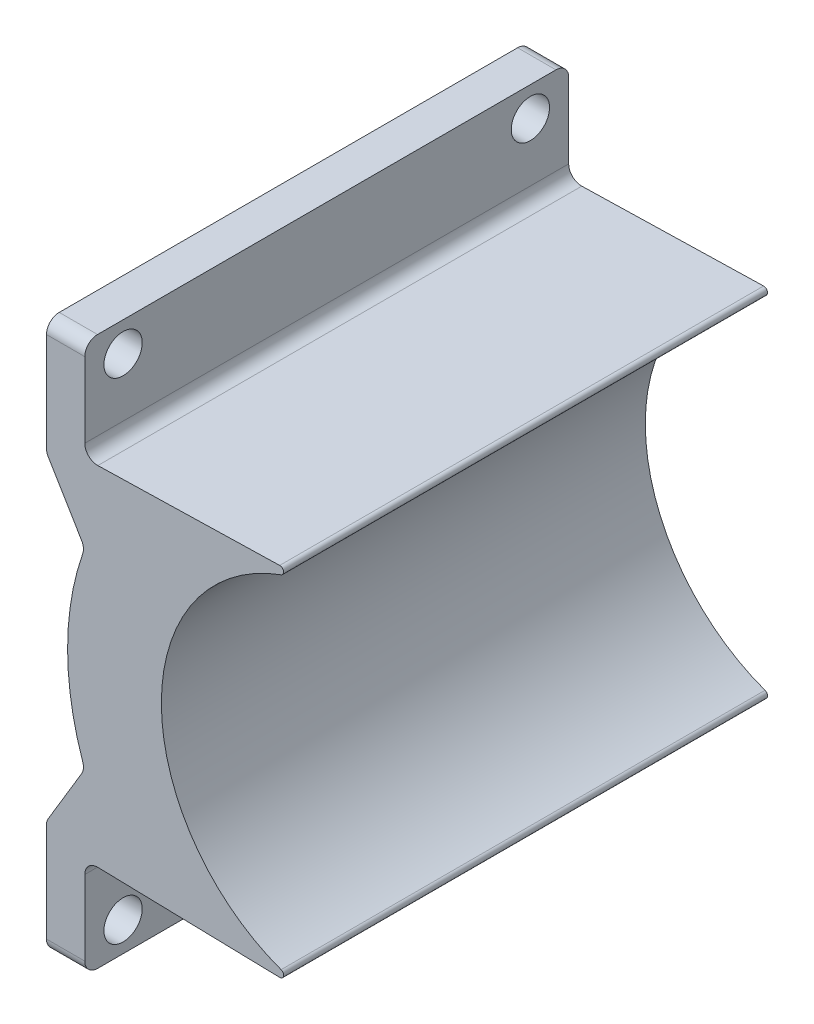
ISO-10303-21;
HEADER;
FILE_DESCRIPTION(('STEP AP214'),'2;1');
FILE_NAME('part.step','',(''),(''),'','','');
FILE_SCHEMA(('AUTOMOTIVE_DESIGN { 1 0 10303 214 1 1 1 1 }'));
ENDSEC;
DATA;
#1=APPLICATION_CONTEXT('core data for automotive mechanical design processes');
#2=APPLICATION_PROTOCOL_DEFINITION('international standard','automotive_design',2000,#1);
#3=PRODUCT_CONTEXT('',#1,'mechanical');
#4=PRODUCT('Part','Part','',(#3));
#5=PRODUCT_RELATED_PRODUCT_CATEGORY('part','',(#4));
#6=PRODUCT_DEFINITION_FORMATION('','',#4);
#7=PRODUCT_DEFINITION_CONTEXT('part definition',#1,'design');
#8=PRODUCT_DEFINITION('design','',#6,#7);
#9=PRODUCT_DEFINITION_SHAPE('','',#8);
#10=(LENGTH_UNIT() NAMED_UNIT(*) SI_UNIT(.MILLI.,.METRE.));
#11=(NAMED_UNIT(*) PLANE_ANGLE_UNIT() SI_UNIT($,.RADIAN.));
#12=(NAMED_UNIT(*) SI_UNIT($,.STERADIAN.) SOLID_ANGLE_UNIT());
#13=UNCERTAINTY_MEASURE_WITH_UNIT(LENGTH_MEASURE(1.E-05),#10,'distance_accuracy_value','');
#14=(GEOMETRIC_REPRESENTATION_CONTEXT(3) GLOBAL_UNCERTAINTY_ASSIGNED_CONTEXT((#13)) GLOBAL_UNIT_ASSIGNED_CONTEXT((#10,
#11,#12)) REPRESENTATION_CONTEXT('',''));
#15=CARTESIAN_POINT('',(0.,0.,0.));
#16=DIRECTION('',(0.,0.,1.));
#17=DIRECTION('',(1.,0.,0.));
#18=AXIS2_PLACEMENT_3D('',#15,#16,#17);
#19=CARTESIAN_POINT('',(18.75,-21.5,37.9));
#20=DIRECTION('',(0.,0.,-1.));
#21=DIRECTION('',(-1.,0.,0.));
#22=AXIS2_PLACEMENT_3D('',#19,#20,#21);
#23=CYLINDRICAL_SURFACE('',#22,14.25);
#24=CARTESIAN_POINT('',(18.75,-21.5,37.9));
#25=DIRECTION('',(0.,0.,-1.));
#26=DIRECTION('',(1.,0.,0.));
#27=AXIS2_PLACEMENT_3D('',#24,#25,#26);
#28=CIRCLE('',#27,14.25);
#29=CARTESIAN_POINT('',(13.8758581465077,-34.890490700196,37.9));
#30=VERTEX_POINT('',#29);
#31=CARTESIAN_POINT('',(13.8758581465076,-8.10950929980405,37.9));
#32=VERTEX_POINT('',#31);
#33=EDGE_CURVE('E222',#30,#32,#28,.T.);
#34=ORIENTED_EDGE('',*,*,#33,.F.);
#35=DIRECTION('',(0.,0.,-1.));
#36=VECTOR('',#35,1.);
#37=CARTESIAN_POINT('',(13.8758581465077,-34.8904907001959,37.9));
#38=LINE('',#37,#36);
#39=CARTESIAN_POINT('',(13.8758581465077,-34.890490700196,0.));
#40=VERTEX_POINT('',#39);
#41=EDGE_CURVE('E208',#30,#40,#38,.T.);
#42=ORIENTED_EDGE('',*,*,#41,.T.);
#43=CARTESIAN_POINT('',(18.75,-21.5,0.));
#44=DIRECTION('',(0.,0.,-1.));
#45=DIRECTION('',(1.,0.,0.));
#46=AXIS2_PLACEMENT_3D('',#43,#44,#45);
#47=CIRCLE('',#46,14.25);
#48=CARTESIAN_POINT('',(13.8758581465076,-8.10950929980405,0.));
#49=VERTEX_POINT('',#48);
#50=EDGE_CURVE('E219',#40,#49,#47,.T.);
#51=ORIENTED_EDGE('',*,*,#50,.T.);
#52=DIRECTION('',(0.,0.,-1.));
#53=VECTOR('',#52,1.);
#54=CARTESIAN_POINT('',(13.8758581465076,-8.10950929980405,37.9));
#55=LINE('',#54,#53);
#56=EDGE_CURVE('E223',#49,#32,#55,.F.);
#57=ORIENTED_EDGE('',*,*,#56,.T.);
#58=EDGE_LOOP('',(#34,#42,#51,#57));
#59=FACE_BOUND('',#58,.T.);
#60=ADVANCED_FACE('F41',(#59),#23,.F.);
#61=CARTESIAN_POINT('',(-1.5,-7.9,37.9));
#62=DIRECTION('',(0.0243808212590845,-0.999702743596682,0.));
#63=DIRECTION('',(0.999702743596682,0.0243808212590845,0.));
#64=AXIS2_PLACEMENT_3D('',#61,#62,#63);
#65=PLANE('',#64);
#66=DIRECTION('',(-0.999702743596682,-0.0243808212590845,0.));
#67=VECTOR('',#66,1.);
#68=CARTESIAN_POINT('',(-1.5,-7.9,0.));
#69=LINE('',#68,#67);
#70=CARTESIAN_POINT('',(13.7659303874248,-7.5276934093525,0.));
#71=VERTEX_POINT('',#70);
#72=CARTESIAN_POINT('',(-0.475619178740915,-7.87501732803644,0.));
#73=VERTEX_POINT('',#72);
#74=EDGE_CURVE('E228',#71,#73,#69,.T.);
#75=ORIENTED_EDGE('',*,*,#74,.T.);
#76=DIRECTION('',(0.,0.,-1.));
#77=VECTOR('',#76,1.);
#78=CARTESIAN_POINT('',(-0.475619178740915,-7.87501732803644,37.9));
#79=LINE('',#78,#77);
#80=CARTESIAN_POINT('',(-0.475619178740915,-7.87501732803644,37.9));
#81=VERTEX_POINT('',#80);
#82=EDGE_CURVE('E291',#73,#81,#79,.F.);
#83=ORIENTED_EDGE('',*,*,#82,.T.);
#84=DIRECTION('',(-0.999702743596682,-0.0243808212590845,0.));
#85=VECTOR('',#84,1.);
#86=CARTESIAN_POINT('',(-1.5,-7.9,37.9));
#87=LINE('',#86,#85);
#88=CARTESIAN_POINT('',(13.7659303874248,-7.5276934093525,37.9));
#89=VERTEX_POINT('',#88);
#90=EDGE_CURVE('E449',#89,#81,#87,.T.);
#91=ORIENTED_EDGE('',*,*,#90,.F.);
#92=DIRECTION('',(0.,0.,-1.));
#93=VECTOR('',#92,1.);
#94=CARTESIAN_POINT('',(13.7659303874248,-7.5276934093525,37.9));
#95=LINE('',#94,#93);
#96=EDGE_CURVE('E281',#89,#71,#95,.T.);
#97=ORIENTED_EDGE('',*,*,#96,.T.);
#98=EDGE_LOOP('',(#75,#83,#91,#97));
#99=FACE_BOUND('',#98,.T.);
#100=ADVANCED_FACE('F427',(#99),#65,.F.);
#101=CARTESIAN_POINT('',(-1.5,0.,37.9));
#102=DIRECTION('',(-1.,0.,0.));
#103=DIRECTION('',(0.,-1.,0.));
#104=AXIS2_PLACEMENT_3D('',#101,#102,#103);
#105=PLANE('',#104);
#106=CARTESIAN_POINT('',(-1.5,-2.3,3.));
#107=DIRECTION('',(-1.,0.,0.));
#108=DIRECTION('',(0.,-1.,0.));
#109=AXIS2_PLACEMENT_3D('',#106,#107,#108);
#110=CIRCLE('',#109,1.5);
#111=CARTESIAN_POINT('',(-1.5,-3.8,3.));
#112=VERTEX_POINT('',#111);
#113=EDGE_CURVE('E547',#112,#112,#110,.F.);
#114=ORIENTED_EDGE('',*,*,#113,.F.);
#115=EDGE_LOOP('',(#114));
#116=FACE_BOUND('',#115,.T.);
#117=CARTESIAN_POINT('',(-1.5,-2.3,34.9));
#118=DIRECTION('',(-1.,0.,0.));
#119=DIRECTION('',(0.,-1.,0.));
#120=AXIS2_PLACEMENT_3D('',#117,#118,#119);
#121=CIRCLE('',#120,1.5);
#122=CARTESIAN_POINT('',(-1.5,-3.8,34.9));
#123=VERTEX_POINT('',#122);
#124=EDGE_CURVE('E550',#123,#123,#121,.F.);
#125=ORIENTED_EDGE('',*,*,#124,.F.);
#126=EDGE_LOOP('',(#125));
#127=FACE_BOUND('',#126,.T.);
#128=DIRECTION('',(0.,1.,0.));
#129=VECTOR('',#128,1.);
#130=CARTESIAN_POINT('',(-1.5,0.,37.9));
#131=LINE('',#130,#129);
#132=CARTESIAN_POINT('',(-1.5,-6.87531458443975,37.9));
#133=VERTEX_POINT('',#132);
#134=CARTESIAN_POINT('',(-1.5,-0.999999999999996,37.9));
#135=VERTEX_POINT('',#134);
#136=EDGE_CURVE('E452',#133,#135,#131,.T.);
#137=ORIENTED_EDGE('',*,*,#136,.F.);
#138=DIRECTION('',(0.,0.,-1.));
#139=VECTOR('',#138,1.);
#140=CARTESIAN_POINT('',(-1.5,-6.87531458443975,0.));
#141=LINE('',#140,#139);
#142=CARTESIAN_POINT('',(-1.5,-6.87531458443975,0.));
#143=VERTEX_POINT('',#142);
#144=EDGE_CURVE('E288',#133,#143,#141,.T.);
#145=ORIENTED_EDGE('',*,*,#144,.T.);
#146=DIRECTION('',(0.,1.,0.));
#147=VECTOR('',#146,1.);
#148=CARTESIAN_POINT('',(-1.5,0.,0.));
#149=LINE('',#148,#147);
#150=CARTESIAN_POINT('',(-1.5,-0.999999999999999,0.));
#151=VERTEX_POINT('',#150);
#152=EDGE_CURVE('E232',#143,#151,#149,.T.);
#153=ORIENTED_EDGE('',*,*,#152,.T.);
#154=CARTESIAN_POINT('',(-1.5,-0.999999999999999,1.));
#155=DIRECTION('',(-1.,0.,0.));
#156=DIRECTION('',(0.,-1.,0.));
#157=AXIS2_PLACEMENT_3D('',#154,#155,#156);
#158=CIRCLE('',#157,1.);
#159=CARTESIAN_POINT('',(-1.5,0.,1.));
#160=VERTEX_POINT('',#159);
#161=EDGE_CURVE('E286',#151,#160,#158,.F.);
#162=ORIENTED_EDGE('',*,*,#161,.T.);
#163=DIRECTION('',(0.,0.,-1.));
#164=VECTOR('',#163,1.);
#165=CARTESIAN_POINT('',(-1.5,0.,37.9));
#166=LINE('',#165,#164);
#167=CARTESIAN_POINT('',(-1.5,0.,36.9));
#168=VERTEX_POINT('',#167);
#169=EDGE_CURVE('E271',#168,#160,#166,.T.);
#170=ORIENTED_EDGE('',*,*,#169,.F.);
#171=CARTESIAN_POINT('',(-1.5,-0.999999999999996,36.9));
#172=DIRECTION('',(-1.,0.,0.));
#173=DIRECTION('',(0.,-1.,0.));
#174=AXIS2_PLACEMENT_3D('',#171,#172,#173);
#175=CIRCLE('',#174,1.);
#176=EDGE_CURVE('E284',#168,#135,#175,.F.);
#177=ORIENTED_EDGE('',*,*,#176,.T.);
#178=EDGE_LOOP('',(#137,#145,#153,#162,#170,#177));
#179=FACE_BOUND('',#178,.T.);
#180=ADVANCED_FACE('F434',(#116,#127,#179),#105,.F.);
#181=CARTESIAN_POINT('',(-1.5,0.,37.9));
#182=DIRECTION('',(0.,-1.,0.));
#183=DIRECTION('',(1.,0.,0.));
#184=AXIS2_PLACEMENT_3D('',#181,#182,#183);
#185=PLANE('',#184);
#186=ORIENTED_EDGE('',*,*,#169,.T.);
#187=DIRECTION('',(-1.,0.,0.));
#188=VECTOR('',#187,1.);
#189=CARTESIAN_POINT('',(-1.5,0.,1.));
#190=LINE('',#189,#188);
#191=CARTESIAN_POINT('',(-4.5,0.,1.));
#192=VERTEX_POINT('',#191);
#193=EDGE_CURVE('E353',#160,#192,#190,.T.);
#194=ORIENTED_EDGE('',*,*,#193,.T.);
#195=DIRECTION('',(0.,0.,-1.));
#196=VECTOR('',#195,1.);
#197=CARTESIAN_POINT('',(-4.5,0.,37.9));
#198=LINE('',#197,#196);
#199=CARTESIAN_POINT('',(-4.5,0.,36.9));
#200=VERTEX_POINT('',#199);
#201=EDGE_CURVE('E269',#200,#192,#198,.T.);
#202=ORIENTED_EDGE('',*,*,#201,.F.);
#203=DIRECTION('',(-1.,0.,0.));
#204=VECTOR('',#203,1.);
#205=CARTESIAN_POINT('',(-1.5,0.,36.9));
#206=LINE('',#205,#204);
#207=EDGE_CURVE('E351',#200,#168,#206,.F.);
#208=ORIENTED_EDGE('',*,*,#207,.T.);
#209=EDGE_LOOP('',(#186,#194,#202,#208));
#210=FACE_BOUND('',#209,.T.);
#211=ADVANCED_FACE('F467',(#210),#185,.F.);
#212=CARTESIAN_POINT('',(-4.5,0.,37.9));
#213=DIRECTION('',(1.,0.,0.));
#214=DIRECTION('',(0.,1.,0.));
#215=AXIS2_PLACEMENT_3D('',#212,#213,#214);
#216=PLANE('',#215);
#217=CARTESIAN_POINT('',(-4.5,-2.3,3.));
#218=DIRECTION('',(-1.,0.,0.));
#219=DIRECTION('',(0.,1.,0.));
#220=AXIS2_PLACEMENT_3D('',#217,#218,#219);
#221=CIRCLE('',#220,1.5);
#222=CARTESIAN_POINT('',(-4.5,-0.799999999999995,3.));
#223=VERTEX_POINT('',#222);
#224=EDGE_CURVE('E561',#223,#223,#221,.T.);
#225=ORIENTED_EDGE('',*,*,#224,.F.);
#226=EDGE_LOOP('',(#225));
#227=FACE_BOUND('',#226,.T.);
#228=CARTESIAN_POINT('',(-4.5,-2.3,34.9));
#229=DIRECTION('',(-1.,0.,0.));
#230=DIRECTION('',(0.,-1.,0.));
#231=AXIS2_PLACEMENT_3D('',#228,#229,#230);
#232=CIRCLE('',#231,1.5);
#233=CARTESIAN_POINT('',(-4.5,-3.8,34.9));
#234=VERTEX_POINT('',#233);
#235=EDGE_CURVE('E552',#234,#234,#232,.T.);
#236=ORIENTED_EDGE('',*,*,#235,.F.);
#237=EDGE_LOOP('',(#236));
#238=FACE_BOUND('',#237,.T.);
#239=DIRECTION('',(0.,-1.,0.));
#240=VECTOR('',#239,1.);
#241=CARTESIAN_POINT('',(-4.5,0.,0.));
#242=LINE('',#241,#240);
#243=CARTESIAN_POINT('',(-4.5,-1.,0.));
#244=VERTEX_POINT('',#243);
#245=CARTESIAN_POINT('',(-4.5,-8.72301603505157,0.));
#246=VERTEX_POINT('',#245);
#247=EDGE_CURVE('E243',#244,#246,#242,.T.);
#248=ORIENTED_EDGE('',*,*,#247,.T.);
#249=DIRECTION('',(0.,0.,-1.));
#250=VECTOR('',#249,1.);
#251=CARTESIAN_POINT('',(-4.5,-8.72301603505157,37.9));
#252=LINE('',#251,#250);
#253=CARTESIAN_POINT('',(-4.5,-8.72301603505157,37.9));
#254=VERTEX_POINT('',#253);
#255=EDGE_CURVE('E349',#246,#254,#252,.F.);
#256=ORIENTED_EDGE('',*,*,#255,.T.);
#257=DIRECTION('',(0.,-1.,0.));
#258=VECTOR('',#257,1.);
#259=CARTESIAN_POINT('',(-4.5,0.,37.9));
#260=LINE('',#259,#258);
#261=CARTESIAN_POINT('',(-4.5,-0.999999999999997,37.9));
#262=VERTEX_POINT('',#261);
#263=EDGE_CURVE('E394',#262,#254,#260,.T.);
#264=ORIENTED_EDGE('',*,*,#263,.F.);
#265=CARTESIAN_POINT('',(-4.5,-0.999999999999997,36.9));
#266=DIRECTION('',(1.,0.,0.));
#267=DIRECTION('',(0.,1.,0.));
#268=AXIS2_PLACEMENT_3D('',#265,#266,#267);
#269=CIRCLE('',#268,1.);
#270=EDGE_CURVE('E64',#262,#200,#269,.F.);
#271=ORIENTED_EDGE('',*,*,#270,.T.);
#272=ORIENTED_EDGE('',*,*,#201,.T.);
#273=CARTESIAN_POINT('',(-4.5,-1.,1.));
#274=DIRECTION('',(1.,0.,0.));
#275=DIRECTION('',(0.,1.,0.));
#276=AXIS2_PLACEMENT_3D('',#273,#274,#275);
#277=CIRCLE('',#276,1.);
#278=EDGE_CURVE('E56',#192,#244,#277,.F.);
#279=ORIENTED_EDGE('',*,*,#278,.T.);
#280=EDGE_LOOP('',(#248,#256,#264,#271,#272,#279));
#281=FACE_BOUND('',#280,.T.);
#282=ADVANCED_FACE('F464',(#227,#238,#281),#216,.F.);
#283=CARTESIAN_POINT('',(-4.5,-9.,37.9));
#284=DIRECTION('',(0.857492925712544,0.514495755427527,0.));
#285=DIRECTION('',(-0.514495755427527,0.857492925712544,0.));
#286=AXIS2_PLACEMENT_3D('',#283,#284,#285);
#287=PLANE('',#286);
#288=DIRECTION('',(0.514495755427527,-0.857492925712544,0.));
#289=VECTOR('',#288,1.);
#290=CARTESIAN_POINT('',(-4.5,-9.,0.));
#291=LINE('',#290,#289);
#292=CARTESIAN_POINT('',(-4.35749292571254,-9.23751179047909,0.));
#293=VERTEX_POINT('',#292);
#294=CARTESIAN_POINT('',(-1.74356341017487,-13.5940609830419,0.));
#295=VERTEX_POINT('',#294);
#296=EDGE_CURVE('E246',#293,#295,#291,.T.);
#297=ORIENTED_EDGE('',*,*,#296,.T.);
#298=DIRECTION('',(0.,0.,1.));
#299=VECTOR('',#298,1.);
#300=CARTESIAN_POINT('',(-1.74356341017487,-13.5940609830419,37.9));
#301=LINE('',#300,#299);
#302=CARTESIAN_POINT('',(-1.74356341017487,-13.5940609830419,37.9));
#303=VERTEX_POINT('',#302);
#304=EDGE_CURVE('E345',#295,#303,#301,.T.);
#305=ORIENTED_EDGE('',*,*,#304,.T.);
#306=DIRECTION('',(0.514495755427527,-0.857492925712544,0.));
#307=VECTOR('',#306,1.);
#308=CARTESIAN_POINT('',(-4.5,-9.,37.9));
#309=LINE('',#308,#307);
#310=CARTESIAN_POINT('',(-4.35749292571254,-9.23751179047909,37.9));
#311=VERTEX_POINT('',#310);
#312=EDGE_CURVE('E385',#311,#303,#309,.T.);
#313=ORIENTED_EDGE('',*,*,#312,.F.);
#314=DIRECTION('',(0.,0.,-1.));
#315=VECTOR('',#314,1.);
#316=CARTESIAN_POINT('',(-4.35749292571254,-9.23751179047909,37.9));
#317=LINE('',#316,#315);
#318=EDGE_CURVE('E342',#311,#293,#317,.T.);
#319=ORIENTED_EDGE('',*,*,#318,.T.);
#320=EDGE_LOOP('',(#297,#305,#313,#319));
#321=FACE_BOUND('',#320,.T.);
#322=ADVANCED_FACE('F372',(#321),#287,.F.);
#323=CARTESIAN_POINT('',(18.75,-21.5,37.9));
#324=DIRECTION('',(0.,0.,-1.));
#325=DIRECTION('',(-1.,0.,0.));
#326=AXIS2_PLACEMENT_3D('',#323,#324,#325);
#327=CYLINDRICAL_SURFACE('',#326,21.594270073332);
#328=CARTESIAN_POINT('',(18.75,-21.5,0.));
#329=DIRECTION('',(0.,0.,1.));
#330=DIRECTION('',(1.,0.,0.));
#331=AXIS2_PLACEMENT_3D('',#328,#329,#330);
#332=CIRCLE('',#331,21.594270073332);
#333=CARTESIAN_POINT('',(-1.65607974374301,-14.4356946914788,0.));
#334=VERTEX_POINT('',#333);
#335=CARTESIAN_POINT('',(-1.65607974374301,-28.5643053085212,0.));
#336=VERTEX_POINT('',#335);
#337=EDGE_CURVE('E249',#334,#336,#332,.T.);
#338=ORIENTED_EDGE('',*,*,#337,.T.);
#339=DIRECTION('',(0.,0.,-1.));
#340=VECTOR('',#339,1.);
#341=CARTESIAN_POINT('',(-1.65607974374302,-28.5643053085212,37.9));
#342=LINE('',#341,#340);
#343=CARTESIAN_POINT('',(-1.65607974374301,-28.5643053085212,37.9));
#344=VERTEX_POINT('',#343);
#345=EDGE_CURVE('E340',#336,#344,#342,.F.);
#346=ORIENTED_EDGE('',*,*,#345,.T.);
#347=CARTESIAN_POINT('',(18.75,-21.5,37.9));
#348=DIRECTION('',(0.,0.,1.));
#349=DIRECTION('',(1.,0.,0.));
#350=AXIS2_PLACEMENT_3D('',#347,#348,#349);
#351=CIRCLE('',#350,21.594270073332);
#352=CARTESIAN_POINT('',(-1.65607974374301,-14.4356946914788,37.9));
#353=VERTEX_POINT('',#352);
#354=EDGE_CURVE('E383',#353,#344,#351,.T.);
#355=ORIENTED_EDGE('',*,*,#354,.F.);
#356=DIRECTION('',(0.,0.,-1.));
#357=VECTOR('',#356,1.);
#358=CARTESIAN_POINT('',(-1.65607974374301,-14.4356946914788,37.9));
#359=LINE('',#358,#357);
#360=EDGE_CURVE('E337',#353,#334,#359,.T.);
#361=ORIENTED_EDGE('',*,*,#360,.T.);
#362=EDGE_LOOP('',(#338,#346,#355,#361));
#363=FACE_BOUND('',#362,.T.);
#364=ADVANCED_FACE('F387',(#363),#327,.T.);
#365=CARTESIAN_POINT('',(-4.5,-34.,37.9));
#366=DIRECTION('',(0.857492925712544,-0.514495755427527,0.));
#367=DIRECTION('',(0.514495755427527,0.857492925712544,0.));
#368=AXIS2_PLACEMENT_3D('',#365,#366,#367);
#369=PLANE('',#368);
#370=DIRECTION('',(-0.514495755427527,-0.857492925712544,0.));
#371=VECTOR('',#370,1.);
#372=CARTESIAN_POINT('',(-4.5,-34.,0.));
#373=LINE('',#372,#371);
#374=CARTESIAN_POINT('',(-1.74356341017486,-29.4059390169581,0.));
#375=VERTEX_POINT('',#374);
#376=CARTESIAN_POINT('',(-4.35749292571254,-33.7624882095209,0.));
#377=VERTEX_POINT('',#376);
#378=EDGE_CURVE('E252',#375,#377,#373,.T.);
#379=ORIENTED_EDGE('',*,*,#378,.T.);
#380=DIRECTION('',(0.,0.,-1.));
#381=VECTOR('',#380,1.);
#382=CARTESIAN_POINT('',(-4.35749292571254,-33.7624882095209,37.9));
#383=LINE('',#382,#381);
#384=CARTESIAN_POINT('',(-4.35749292571254,-33.7624882095209,37.9));
#385=VERTEX_POINT('',#384);
#386=EDGE_CURVE('E335',#377,#385,#383,.F.);
#387=ORIENTED_EDGE('',*,*,#386,.T.);
#388=DIRECTION('',(-0.514495755427527,-0.857492925712544,0.));
#389=VECTOR('',#388,1.);
#390=CARTESIAN_POINT('',(-4.5,-34.,37.9));
#391=LINE('',#390,#389);
#392=CARTESIAN_POINT('',(-1.74356341017486,-29.4059390169581,37.9));
#393=VERTEX_POINT('',#392);
#394=EDGE_CURVE('E389',#393,#385,#391,.T.);
#395=ORIENTED_EDGE('',*,*,#394,.F.);
#396=DIRECTION('',(0.,0.,1.));
#397=VECTOR('',#396,1.);
#398=CARTESIAN_POINT('',(-1.74356341017486,-29.4059390169581,0.));
#399=LINE('',#398,#397);
#400=EDGE_CURVE('E332',#393,#375,#399,.F.);
#401=ORIENTED_EDGE('',*,*,#400,.T.);
#402=EDGE_LOOP('',(#379,#387,#395,#401));
#403=FACE_BOUND('',#402,.T.);
#404=ADVANCED_FACE('F524',(#403),#369,.F.);
#405=CARTESIAN_POINT('',(-4.5,-43.,37.9));
#406=DIRECTION('',(1.,0.,0.));
#407=DIRECTION('',(0.,1.,0.));
#408=AXIS2_PLACEMENT_3D('',#405,#406,#407);
#409=PLANE('',#408);
#410=CARTESIAN_POINT('',(-4.5,-40.7,34.9));
#411=DIRECTION('',(-1.,0.,0.));
#412=DIRECTION('',(0.,1.,0.));
#413=AXIS2_PLACEMENT_3D('',#410,#411,#412);
#414=CIRCLE('',#413,1.5);
#415=CARTESIAN_POINT('',(-4.5,-39.2,34.9));
#416=VERTEX_POINT('',#415);
#417=EDGE_CURVE('E560',#416,#416,#414,.T.);
#418=ORIENTED_EDGE('',*,*,#417,.F.);
#419=EDGE_LOOP('',(#418));
#420=FACE_BOUND('',#419,.T.);
#421=CARTESIAN_POINT('',(-4.5,-40.7,3.));
#422=DIRECTION('',(-1.,0.,0.));
#423=DIRECTION('',(0.,-1.,0.));
#424=AXIS2_PLACEMENT_3D('',#421,#422,#423);
#425=CIRCLE('',#424,1.5);
#426=CARTESIAN_POINT('',(-4.5,-42.2,3.));
#427=VERTEX_POINT('',#426);
#428=EDGE_CURVE('E235',#427,#427,#425,.T.);
#429=ORIENTED_EDGE('',*,*,#428,.F.);
#430=EDGE_LOOP('',(#429));
#431=FACE_BOUND('',#430,.T.);
#432=DIRECTION('',(0.,-1.,0.));
#433=VECTOR('',#432,1.);
#434=CARTESIAN_POINT('',(-4.5,-43.,0.));
#435=LINE('',#434,#433);
#436=CARTESIAN_POINT('',(-4.5,-34.2769839649484,0.));
#437=VERTEX_POINT('',#436);
#438=CARTESIAN_POINT('',(-4.5,-42.,0.));
#439=VERTEX_POINT('',#438);
#440=EDGE_CURVE('E255',#437,#439,#435,.T.);
#441=ORIENTED_EDGE('',*,*,#440,.T.);
#442=CARTESIAN_POINT('',(-4.5,-42.,1.));
#443=DIRECTION('',(1.,0.,0.));
#444=DIRECTION('',(0.,1.,0.));
#445=AXIS2_PLACEMENT_3D('',#442,#443,#444);
#446=CIRCLE('',#445,1.);
#447=CARTESIAN_POINT('',(-4.5,-43.,1.));
#448=VERTEX_POINT('',#447);
#449=EDGE_CURVE('E320',#439,#448,#446,.F.);
#450=ORIENTED_EDGE('',*,*,#449,.T.);
#451=DIRECTION('',(0.,0.,-1.));
#452=VECTOR('',#451,1.);
#453=CARTESIAN_POINT('',(-4.5,-43.,37.9));
#454=LINE('',#453,#452);
#455=CARTESIAN_POINT('',(-4.5,-43.,36.9));
#456=VERTEX_POINT('',#455);
#457=EDGE_CURVE('E266',#456,#448,#454,.T.);
#458=ORIENTED_EDGE('',*,*,#457,.F.);
#459=CARTESIAN_POINT('',(-4.5,-42.,36.9));
#460=DIRECTION('',(1.,0.,0.));
#461=DIRECTION('',(0.,1.,0.));
#462=AXIS2_PLACEMENT_3D('',#459,#460,#461);
#463=CIRCLE('',#462,1.);
#464=CARTESIAN_POINT('',(-4.5,-42.,37.9));
#465=VERTEX_POINT('',#464);
#466=EDGE_CURVE('E318',#456,#465,#463,.F.);
#467=ORIENTED_EDGE('',*,*,#466,.T.);
#468=DIRECTION('',(0.,-1.,0.));
#469=VECTOR('',#468,1.);
#470=CARTESIAN_POINT('',(-4.5,-43.,37.9));
#471=LINE('',#470,#469);
#472=CARTESIAN_POINT('',(-4.5,-34.2769839649484,37.9));
#473=VERTEX_POINT('',#472);
#474=EDGE_CURVE('E392',#473,#465,#471,.T.);
#475=ORIENTED_EDGE('',*,*,#474,.F.);
#476=DIRECTION('',(0.,0.,-1.));
#477=VECTOR('',#476,1.);
#478=CARTESIAN_POINT('',(-4.5,-34.2769839649484,37.9));
#479=LINE('',#478,#477);
#480=EDGE_CURVE('E315',#473,#437,#479,.T.);
#481=ORIENTED_EDGE('',*,*,#480,.T.);
#482=EDGE_LOOP('',(#441,#450,#458,#467,#475,#481));
#483=FACE_BOUND('',#482,.T.);
#484=ADVANCED_FACE('F504',(#420,#431,#483),#409,.F.);
#485=CARTESIAN_POINT('',(-1.5,-43.,37.9));
#486=DIRECTION('',(0.,1.,0.));
#487=DIRECTION('',(0.,0.,1.));
#488=AXIS2_PLACEMENT_3D('',#485,#486,#487);
#489=PLANE('',#488);
#490=ORIENTED_EDGE('',*,*,#457,.T.);
#491=DIRECTION('',(1.,0.,0.));
#492=VECTOR('',#491,1.);
#493=CARTESIAN_POINT('',(-1.5,-43.,1.));
#494=LINE('',#493,#492);
#495=CARTESIAN_POINT('',(-1.5,-43.,1.));
#496=VERTEX_POINT('',#495);
#497=EDGE_CURVE('E304',#448,#496,#494,.T.);
#498=ORIENTED_EDGE('',*,*,#497,.T.);
#499=DIRECTION('',(0.,0.,-1.));
#500=VECTOR('',#499,1.);
#501=CARTESIAN_POINT('',(-1.5,-43.,37.9));
#502=LINE('',#501,#500);
#503=CARTESIAN_POINT('',(-1.5,-43.,36.9));
#504=VERTEX_POINT('',#503);
#505=EDGE_CURVE('E263',#504,#496,#502,.T.);
#506=ORIENTED_EDGE('',*,*,#505,.F.);
#507=DIRECTION('',(1.,0.,0.));
#508=VECTOR('',#507,1.);
#509=CARTESIAN_POINT('',(-4.5,-43.,36.9));
#510=LINE('',#509,#508);
#511=EDGE_CURVE('E302',#504,#456,#510,.F.);
#512=ORIENTED_EDGE('',*,*,#511,.T.);
#513=EDGE_LOOP('',(#490,#498,#506,#512));
#514=FACE_BOUND('',#513,.T.);
#515=ADVANCED_FACE('F514',(#514),#489,.F.);
#516=CARTESIAN_POINT('',(-1.5,-43.,37.9));
#517=DIRECTION('',(-1.,0.,0.));
#518=DIRECTION('',(0.,-1.,0.));
#519=AXIS2_PLACEMENT_3D('',#516,#517,#518);
#520=PLANE('',#519);
#521=CARTESIAN_POINT('',(-1.5,-40.7,34.9));
#522=DIRECTION('',(-1.,0.,0.));
#523=DIRECTION('',(0.,-1.,0.));
#524=AXIS2_PLACEMENT_3D('',#521,#522,#523);
#525=CIRCLE('',#524,1.5);
#526=CARTESIAN_POINT('',(-1.5,-42.2,34.9));
#527=VERTEX_POINT('',#526);
#528=EDGE_CURVE('E557',#527,#527,#525,.F.);
#529=ORIENTED_EDGE('',*,*,#528,.F.);
#530=EDGE_LOOP('',(#529));
#531=FACE_BOUND('',#530,.T.);
#532=CARTESIAN_POINT('',(-1.5,-40.7,3.));
#533=DIRECTION('',(-1.,0.,0.));
#534=DIRECTION('',(0.,-1.,0.));
#535=AXIS2_PLACEMENT_3D('',#532,#533,#534);
#536=CIRCLE('',#535,1.5);
#537=CARTESIAN_POINT('',(-1.5,-42.2,3.));
#538=VERTEX_POINT('',#537);
#539=EDGE_CURVE('E229',#538,#538,#536,.F.);
#540=ORIENTED_EDGE('',*,*,#539,.F.);
#541=EDGE_LOOP('',(#540));
#542=FACE_BOUND('',#541,.T.);
#543=DIRECTION('',(0.,1.,0.));
#544=VECTOR('',#543,1.);
#545=CARTESIAN_POINT('',(-1.5,-43.,0.));
#546=LINE('',#545,#544);
#547=CARTESIAN_POINT('',(-1.5,-42.,0.));
#548=VERTEX_POINT('',#547);
#549=CARTESIAN_POINT('',(-1.5,-36.1246854155602,0.));
#550=VERTEX_POINT('',#549);
#551=EDGE_CURVE('E258',#548,#550,#546,.T.);
#552=ORIENTED_EDGE('',*,*,#551,.T.);
#553=DIRECTION('',(0.,0.,-1.));
#554=VECTOR('',#553,1.);
#555=CARTESIAN_POINT('',(-1.5,-36.1246854155602,37.9));
#556=LINE('',#555,#554);
#557=CARTESIAN_POINT('',(-1.5,-36.1246854155602,37.9));
#558=VERTEX_POINT('',#557);
#559=EDGE_CURVE('E300',#550,#558,#556,.F.);
#560=ORIENTED_EDGE('',*,*,#559,.T.);
#561=DIRECTION('',(0.,1.,0.));
#562=VECTOR('',#561,1.);
#563=CARTESIAN_POINT('',(-1.5,-43.,37.9));
#564=LINE('',#563,#562);
#565=CARTESIAN_POINT('',(-1.5,-42.,37.9));
#566=VERTEX_POINT('',#565);
#567=EDGE_CURVE('E398',#566,#558,#564,.T.);
#568=ORIENTED_EDGE('',*,*,#567,.F.);
#569=CARTESIAN_POINT('',(-1.5,-42.,36.9));
#570=DIRECTION('',(-1.,0.,0.));
#571=DIRECTION('',(0.,-1.,0.));
#572=AXIS2_PLACEMENT_3D('',#569,#570,#571);
#573=CIRCLE('',#572,1.);
#574=EDGE_CURVE('E296',#566,#504,#573,.F.);
#575=ORIENTED_EDGE('',*,*,#574,.T.);
#576=ORIENTED_EDGE('',*,*,#505,.T.);
#577=CARTESIAN_POINT('',(-1.5,-42.,1.));
#578=DIRECTION('',(-1.,0.,0.));
#579=DIRECTION('',(0.,-1.,0.));
#580=AXIS2_PLACEMENT_3D('',#577,#578,#579);
#581=CIRCLE('',#580,1.);
#582=EDGE_CURVE('E298',#496,#548,#581,.F.);
#583=ORIENTED_EDGE('',*,*,#582,.T.);
#584=EDGE_LOOP('',(#552,#560,#568,#575,#576,#583));
#585=FACE_BOUND('',#584,.T.);
#586=ADVANCED_FACE('F410',(#531,#542,#585),#520,.F.);
#587=CARTESIAN_POINT('',(-1.5,-35.1,37.9));
#588=DIRECTION('',(0.0243808212590847,0.999702743596682,0.));
#589=DIRECTION('',(-0.999702743596682,0.0243808212590847,0.));
#590=AXIS2_PLACEMENT_3D('',#587,#588,#589);
#591=PLANE('',#590);
#592=DIRECTION('',(0.999702743596682,-0.0243808212590847,0.));
#593=VECTOR('',#592,1.);
#594=CARTESIAN_POINT('',(-1.5,-35.1,37.9));
#595=LINE('',#594,#593);
#596=CARTESIAN_POINT('',(-0.475619178740914,-35.1249826719636,37.9));
#597=VERTEX_POINT('',#596);
#598=CARTESIAN_POINT('',(13.7659303874248,-35.4723065906475,37.9));
#599=VERTEX_POINT('',#598);
#600=EDGE_CURVE('E238',#597,#599,#595,.T.);
#601=ORIENTED_EDGE('',*,*,#600,.F.);
#602=DIRECTION('',(0.,0.,-1.));
#603=VECTOR('',#602,1.);
#604=CARTESIAN_POINT('',(-0.475619178740914,-35.1249826719636,0.));
#605=LINE('',#604,#603);
#606=CARTESIAN_POINT('',(-0.475619178740914,-35.1249826719636,0.));
#607=VERTEX_POINT('',#606);
#608=EDGE_CURVE('E293',#597,#607,#605,.T.);
#609=ORIENTED_EDGE('',*,*,#608,.T.);
#610=DIRECTION('',(0.999702743596682,-0.0243808212590847,0.));
#611=VECTOR('',#610,1.);
#612=CARTESIAN_POINT('',(-1.5,-35.1,0.));
#613=LINE('',#612,#611);
#614=CARTESIAN_POINT('',(13.7659303874248,-35.4723065906475,0.));
#615=VERTEX_POINT('',#614);
#616=EDGE_CURVE('E261',#607,#615,#613,.T.);
#617=ORIENTED_EDGE('',*,*,#616,.T.);
#618=DIRECTION('',(0.,0.,-1.));
#619=VECTOR('',#618,1.);
#620=CARTESIAN_POINT('',(13.7659303874248,-35.4723065906475,37.9));
#621=LINE('',#620,#619);
#622=EDGE_CURVE('E210',#615,#599,#621,.F.);
#623=ORIENTED_EDGE('',*,*,#622,.T.);
#624=EDGE_LOOP('',(#601,#609,#617,#623));
#625=FACE_BOUND('',#624,.T.);
#626=ADVANCED_FACE('F405',(#625),#591,.F.);
#627=CARTESIAN_POINT('',(18.75,-21.5,37.9));
#628=DIRECTION('',(0.,0.,1.));
#629=DIRECTION('',(1.,0.,0.));
#630=AXIS2_PLACEMENT_3D('',#627,#628,#629);
#631=PLANE('',#630);
#632=ORIENTED_EDGE('',*,*,#474,.T.);
#633=DIRECTION('',(1.,0.,0.));
#634=VECTOR('',#633,1.);
#635=CARTESIAN_POINT('',(-1.5,-42.,37.9));
#636=LINE('',#635,#634);
#637=EDGE_CURVE('E329',#465,#566,#636,.T.);
#638=ORIENTED_EDGE('',*,*,#637,.T.);
#639=ORIENTED_EDGE('',*,*,#567,.T.);
#640=CARTESIAN_POINT('',(-0.499999999999999,-36.1246854155602,37.9));
#641=DIRECTION('',(0.,0.,1.));
#642=DIRECTION('',(1.,0.,0.));
#643=AXIS2_PLACEMENT_3D('',#640,#641,#642);
#644=CIRCLE('',#643,1.);
#645=EDGE_CURVE('E361',#558,#597,#644,.F.);
#646=ORIENTED_EDGE('',*,*,#645,.T.);
#647=ORIENTED_EDGE('',*,*,#600,.T.);
#648=CARTESIAN_POINT('',(13.7732446338026,-35.1723957675685,37.9));
#649=DIRECTION('',(0.,0.,1.));
#650=DIRECTION('',(1.,0.,0.));
#651=AXIS2_PLACEMENT_3D('',#648,#649,#650);
#652=CIRCLE('',#651,0.3);
#653=EDGE_CURVE('E279',#599,#30,#652,.T.);
#654=ORIENTED_EDGE('',*,*,#653,.T.);
#655=ORIENTED_EDGE('',*,*,#33,.T.);
#656=CARTESIAN_POINT('',(13.7732446338025,-7.82760423243151,37.9));
#657=DIRECTION('',(0.,0.,1.));
#658=DIRECTION('',(1.,0.,0.));
#659=AXIS2_PLACEMENT_3D('',#656,#657,#658);
#660=CIRCLE('',#659,0.3);
#661=EDGE_CURVE('E277',#32,#89,#660,.T.);
#662=ORIENTED_EDGE('',*,*,#661,.T.);
#663=ORIENTED_EDGE('',*,*,#90,.T.);
#664=CARTESIAN_POINT('',(-0.499999999999999,-6.87531458443975,37.9));
#665=DIRECTION('',(0.,0.,1.));
#666=DIRECTION('',(1.,0.,0.));
#667=AXIS2_PLACEMENT_3D('',#664,#665,#666);
#668=CIRCLE('',#667,1.);
#669=EDGE_CURVE('E357',#81,#133,#668,.F.);
#670=ORIENTED_EDGE('',*,*,#669,.T.);
#671=ORIENTED_EDGE('',*,*,#136,.T.);
#672=DIRECTION('',(-1.,0.,0.));
#673=VECTOR('',#672,1.);
#674=CARTESIAN_POINT('',(-4.5,-0.999999999999997,37.9));
#675=LINE('',#674,#673);
#676=EDGE_CURVE('E322',#135,#262,#675,.T.);
#677=ORIENTED_EDGE('',*,*,#676,.T.);
#678=ORIENTED_EDGE('',*,*,#263,.T.);
#679=CARTESIAN_POINT('',(-3.5,-8.72301603505157,37.9));
#680=DIRECTION('',(0.,0.,1.));
#681=DIRECTION('',(1.,0.,0.));
#682=AXIS2_PLACEMENT_3D('',#679,#680,#681);
#683=CIRCLE('',#682,1.);
#684=EDGE_CURVE('E325',#254,#311,#683,.T.);
#685=ORIENTED_EDGE('',*,*,#684,.T.);
#686=ORIENTED_EDGE('',*,*,#312,.T.);
#687=CARTESIAN_POINT('',(-2.60105633588741,-14.1085567384694,37.9));
#688=DIRECTION('',(0.,0.,1.));
#689=DIRECTION('',(1.,0.,0.));
#690=AXIS2_PLACEMENT_3D('',#687,#688,#689);
#691=CIRCLE('',#690,1.);
#692=EDGE_CURVE('E11',#303,#353,#691,.F.);
#693=ORIENTED_EDGE('',*,*,#692,.T.);
#694=ORIENTED_EDGE('',*,*,#354,.T.);
#695=CARTESIAN_POINT('',(-2.60105633588741,-28.8914432615306,37.9));
#696=DIRECTION('',(0.,0.,1.));
#697=DIRECTION('',(1.,0.,0.));
#698=AXIS2_PLACEMENT_3D('',#695,#696,#697);
#699=CIRCLE('',#698,1.);
#700=EDGE_CURVE('E365',#344,#393,#699,.F.);
#701=ORIENTED_EDGE('',*,*,#700,.T.);
#702=ORIENTED_EDGE('',*,*,#394,.T.);
#703=CARTESIAN_POINT('',(-3.5,-34.2769839649484,37.9));
#704=DIRECTION('',(0.,0.,1.));
#705=DIRECTION('',(1.,0.,0.));
#706=AXIS2_PLACEMENT_3D('',#703,#704,#705);
#707=CIRCLE('',#706,1.);
#708=EDGE_CURVE('E327',#385,#473,#707,.T.);
#709=ORIENTED_EDGE('',*,*,#708,.T.);
#710=EDGE_LOOP('',(#632,#638,#639,#646,#647,#654,#655,#662,#663,#670,#671,#677,#678,#685,#686,
#693,#694,#701,#702,#709));
#711=FACE_BOUND('',#710,.T.);
#712=ADVANCED_FACE('F382',(#711),#631,.T.);
#713=CARTESIAN_POINT('',(18.75,-21.5,0.));
#714=DIRECTION('',(0.,0.,1.));
#715=DIRECTION('',(1.,0.,0.));
#716=AXIS2_PLACEMENT_3D('',#713,#714,#715);
#717=PLANE('',#716);
#718=ORIENTED_EDGE('',*,*,#551,.F.);
#719=DIRECTION('',(1.,0.,0.));
#720=VECTOR('',#719,1.);
#721=CARTESIAN_POINT('',(18.75,-42.,0.));
#722=LINE('',#721,#720);
#723=EDGE_CURVE('E313',#548,#439,#722,.F.);
#724=ORIENTED_EDGE('',*,*,#723,.T.);
#725=ORIENTED_EDGE('',*,*,#440,.F.);
#726=CARTESIAN_POINT('',(-3.5,-34.2769839649484,0.));
#727=DIRECTION('',(0.,0.,1.));
#728=DIRECTION('',(1.,0.,0.));
#729=AXIS2_PLACEMENT_3D('',#726,#727,#728);
#730=CIRCLE('',#729,1.);
#731=EDGE_CURVE('E311',#437,#377,#730,.F.);
#732=ORIENTED_EDGE('',*,*,#731,.T.);
#733=ORIENTED_EDGE('',*,*,#378,.F.);
#734=CARTESIAN_POINT('',(-2.60105633588741,-28.8914432615306,0.));
#735=DIRECTION('',(0.,0.,1.));
#736=DIRECTION('',(1.,0.,0.));
#737=AXIS2_PLACEMENT_3D('',#734,#735,#736);
#738=CIRCLE('',#737,1.);
#739=EDGE_CURVE('E363',#375,#336,#738,.T.);
#740=ORIENTED_EDGE('',*,*,#739,.T.);
#741=ORIENTED_EDGE('',*,*,#337,.F.);
#742=CARTESIAN_POINT('',(-2.60105633588741,-14.1085567384694,0.));
#743=DIRECTION('',(0.,0.,1.));
#744=DIRECTION('',(1.,0.,0.));
#745=AXIS2_PLACEMENT_3D('',#742,#743,#744);
#746=CIRCLE('',#745,1.);
#747=EDGE_CURVE('E49',#334,#295,#746,.T.);
#748=ORIENTED_EDGE('',*,*,#747,.T.);
#749=ORIENTED_EDGE('',*,*,#296,.F.);
#750=CARTESIAN_POINT('',(-3.5,-8.72301603505157,0.));
#751=DIRECTION('',(0.,0.,1.));
#752=DIRECTION('',(1.,0.,0.));
#753=AXIS2_PLACEMENT_3D('',#750,#751,#752);
#754=CIRCLE('',#753,1.);
#755=EDGE_CURVE('E309',#293,#246,#754,.F.);
#756=ORIENTED_EDGE('',*,*,#755,.T.);
#757=ORIENTED_EDGE('',*,*,#247,.F.);
#758=DIRECTION('',(-1.,0.,0.));
#759=VECTOR('',#758,1.);
#760=CARTESIAN_POINT('',(18.75,-0.999999999999994,0.));
#761=LINE('',#760,#759);
#762=EDGE_CURVE('E307',#244,#151,#761,.F.);
#763=ORIENTED_EDGE('',*,*,#762,.T.);
#764=ORIENTED_EDGE('',*,*,#152,.F.);
#765=CARTESIAN_POINT('',(-0.499999999999999,-6.87531458443975,0.));
#766=DIRECTION('',(0.,0.,1.));
#767=DIRECTION('',(1.,0.,0.));
#768=AXIS2_PLACEMENT_3D('',#765,#766,#767);
#769=CIRCLE('',#768,1.);
#770=EDGE_CURVE('E355',#143,#73,#769,.T.);
#771=ORIENTED_EDGE('',*,*,#770,.T.);
#772=ORIENTED_EDGE('',*,*,#74,.F.);
#773=CARTESIAN_POINT('',(13.7732446338025,-7.82760423243151,0.));
#774=DIRECTION('',(0.,0.,1.));
#775=DIRECTION('',(1.,0.,0.));
#776=AXIS2_PLACEMENT_3D('',#773,#774,#775);
#777=CIRCLE('',#776,0.3);
#778=EDGE_CURVE('E214',#71,#49,#777,.F.);
#779=ORIENTED_EDGE('',*,*,#778,.T.);
#780=ORIENTED_EDGE('',*,*,#50,.F.);
#781=CARTESIAN_POINT('',(13.7732446338026,-35.1723957675685,0.));
#782=DIRECTION('',(0.,0.,1.));
#783=DIRECTION('',(1.,0.,0.));
#784=AXIS2_PLACEMENT_3D('',#781,#782,#783);
#785=CIRCLE('',#784,0.3);
#786=EDGE_CURVE('E204',#40,#615,#785,.F.);
#787=ORIENTED_EDGE('',*,*,#786,.T.);
#788=ORIENTED_EDGE('',*,*,#616,.F.);
#789=CARTESIAN_POINT('',(-0.499999999999999,-36.1246854155602,0.));
#790=DIRECTION('',(0.,0.,1.));
#791=DIRECTION('',(1.,0.,0.));
#792=AXIS2_PLACEMENT_3D('',#789,#790,#791);
#793=CIRCLE('',#792,1.);
#794=EDGE_CURVE('E359',#607,#550,#793,.T.);
#795=ORIENTED_EDGE('',*,*,#794,.T.);
#796=EDGE_LOOP('',(#718,#724,#725,#732,#733,#740,#741,#748,#749,#756,#757,#763,#764,#771,#772,
#779,#780,#787,#788,#795));
#797=FACE_BOUND('',#796,.T.);
#798=ADVANCED_FACE('F226',(#797),#717,.F.);
#799=CARTESIAN_POINT('',(16.2765134682463,-40.7,3.));
#800=DIRECTION('',(-1.,0.,0.));
#801=DIRECTION('',(0.,-1.,0.));
#802=AXIS2_PLACEMENT_3D('',#799,#800,#801);
#803=CYLINDRICAL_SURFACE('',#802,1.5);
#804=ORIENTED_EDGE('',*,*,#428,.T.);
#805=EDGE_LOOP('',(#804));
#806=FACE_BOUND('',#805,.T.);
#807=ORIENTED_EDGE('',*,*,#539,.T.);
#808=EDGE_LOOP('',(#807));
#809=FACE_BOUND('',#808,.T.);
#810=ADVANCED_FACE('F570',(#806,#809),#803,.F.);
#811=CARTESIAN_POINT('',(16.2765134682463,-40.7,34.9));
#812=DIRECTION('',(-1.,0.,0.));
#813=DIRECTION('',(0.,-1.,0.));
#814=AXIS2_PLACEMENT_3D('',#811,#812,#813);
#815=CYLINDRICAL_SURFACE('',#814,1.5);
#816=ORIENTED_EDGE('',*,*,#417,.T.);
#817=EDGE_LOOP('',(#816));
#818=FACE_BOUND('',#817,.T.);
#819=ORIENTED_EDGE('',*,*,#528,.T.);
#820=EDGE_LOOP('',(#819));
#821=FACE_BOUND('',#820,.T.);
#822=ADVANCED_FACE('F574',(#818,#821),#815,.F.);
#823=CARTESIAN_POINT('',(16.2765134682463,-2.3,34.9));
#824=DIRECTION('',(-1.,0.,0.));
#825=DIRECTION('',(0.,-1.,0.));
#826=AXIS2_PLACEMENT_3D('',#823,#824,#825);
#827=CYLINDRICAL_SURFACE('',#826,1.5);
#828=ORIENTED_EDGE('',*,*,#235,.T.);
#829=EDGE_LOOP('',(#828));
#830=FACE_BOUND('',#829,.T.);
#831=ORIENTED_EDGE('',*,*,#124,.T.);
#832=EDGE_LOOP('',(#831));
#833=FACE_BOUND('',#832,.T.);
#834=ADVANCED_FACE('F581',(#830,#833),#827,.F.);
#835=CARTESIAN_POINT('',(16.2765134682463,-2.3,3.));
#836=DIRECTION('',(-1.,0.,0.));
#837=DIRECTION('',(0.,-1.,0.));
#838=AXIS2_PLACEMENT_3D('',#835,#836,#837);
#839=CYLINDRICAL_SURFACE('',#838,1.5);
#840=ORIENTED_EDGE('',*,*,#224,.T.);
#841=EDGE_LOOP('',(#840));
#842=FACE_BOUND('',#841,.T.);
#843=ORIENTED_EDGE('',*,*,#113,.T.);
#844=EDGE_LOOP('',(#843));
#845=FACE_BOUND('',#844,.T.);
#846=ADVANCED_FACE('F440',(#842,#845),#839,.F.);
#847=CARTESIAN_POINT('',(13.7732446338026,-35.1723957675685,37.9));
#848=DIRECTION('',(0.,0.,-1.));
#849=DIRECTION('',(-1.,0.,0.));
#850=AXIS2_PLACEMENT_3D('',#847,#848,#849);
#851=CYLINDRICAL_SURFACE('',#850,0.3);
#852=ORIENTED_EDGE('',*,*,#653,.F.);
#853=ORIENTED_EDGE('',*,*,#622,.F.);
#854=ORIENTED_EDGE('',*,*,#786,.F.);
#855=ORIENTED_EDGE('',*,*,#41,.F.);
#856=EDGE_LOOP('',(#852,#853,#854,#855));
#857=FACE_BOUND('',#856,.T.);
#858=ADVANCED_FACE('F207',(#857),#851,.T.);
#859=CARTESIAN_POINT('',(13.7732446338025,-7.82760423243151,37.9));
#860=DIRECTION('',(0.,0.,-1.));
#861=DIRECTION('',(-1.,0.,0.));
#862=AXIS2_PLACEMENT_3D('',#859,#860,#861);
#863=CYLINDRICAL_SURFACE('',#862,0.3);
#864=ORIENTED_EDGE('',*,*,#661,.F.);
#865=ORIENTED_EDGE('',*,*,#56,.F.);
#866=ORIENTED_EDGE('',*,*,#778,.F.);
#867=ORIENTED_EDGE('',*,*,#96,.F.);
#868=EDGE_LOOP('',(#864,#865,#866,#867));
#869=FACE_BOUND('',#868,.T.);
#870=ADVANCED_FACE('F423',(#869),#863,.T.);
#871=CARTESIAN_POINT('',(-0.499999999999999,-6.87531458443975,37.9));
#872=DIRECTION('',(0.,0.,1.));
#873=DIRECTION('',(1.,0.,0.));
#874=AXIS2_PLACEMENT_3D('',#871,#872,#873);
#875=CYLINDRICAL_SURFACE('',#874,1.);
#876=ORIENTED_EDGE('',*,*,#669,.F.);
#877=ORIENTED_EDGE('',*,*,#82,.F.);
#878=ORIENTED_EDGE('',*,*,#770,.F.);
#879=ORIENTED_EDGE('',*,*,#144,.F.);
#880=EDGE_LOOP('',(#876,#877,#878,#879));
#881=FACE_BOUND('',#880,.T.);
#882=ADVANCED_FACE('F414',(#881),#875,.F.);
#883=CARTESIAN_POINT('',(-0.499999999999999,-36.1246854155602,37.9));
#884=DIRECTION('',(0.,0.,1.));
#885=DIRECTION('',(1.,0.,0.));
#886=AXIS2_PLACEMENT_3D('',#883,#884,#885);
#887=CYLINDRICAL_SURFACE('',#886,1.);
#888=ORIENTED_EDGE('',*,*,#645,.F.);
#889=ORIENTED_EDGE('',*,*,#559,.F.);
#890=ORIENTED_EDGE('',*,*,#794,.F.);
#891=ORIENTED_EDGE('',*,*,#608,.F.);
#892=EDGE_LOOP('',(#888,#889,#890,#891));
#893=FACE_BOUND('',#892,.T.);
#894=ADVANCED_FACE('F411',(#893),#887,.F.);
#895=CARTESIAN_POINT('',(-1.5,-42.,1.));
#896=DIRECTION('',(1.,0.,0.));
#897=DIRECTION('',(0.,0.,-1.));
#898=AXIS2_PLACEMENT_3D('',#895,#896,#897);
#899=CYLINDRICAL_SURFACE('',#898,1.);
#900=ORIENTED_EDGE('',*,*,#449,.F.);
#901=ORIENTED_EDGE('',*,*,#723,.F.);
#902=ORIENTED_EDGE('',*,*,#582,.F.);
#903=ORIENTED_EDGE('',*,*,#497,.F.);
#904=EDGE_LOOP('',(#900,#901,#902,#903));
#905=FACE_BOUND('',#904,.T.);
#906=ADVANCED_FACE('F413',(#905),#899,.T.);
#907=CARTESIAN_POINT('',(18.75,-42.,36.9));
#908=DIRECTION('',(-1.,0.,0.));
#909=DIRECTION('',(0.,0.,1.));
#910=AXIS2_PLACEMENT_3D('',#907,#908,#909);
#911=CYLINDRICAL_SURFACE('',#910,1.);
#912=ORIENTED_EDGE('',*,*,#466,.F.);
#913=ORIENTED_EDGE('',*,*,#511,.F.);
#914=ORIENTED_EDGE('',*,*,#574,.F.);
#915=ORIENTED_EDGE('',*,*,#637,.F.);
#916=EDGE_LOOP('',(#912,#913,#914,#915));
#917=FACE_BOUND('',#916,.T.);
#918=ADVANCED_FACE('F420',(#917),#911,.T.);
#919=CARTESIAN_POINT('',(-3.5,-34.2769839649484,37.9));
#920=DIRECTION('',(0.,0.,-1.));
#921=DIRECTION('',(-1.,0.,0.));
#922=AXIS2_PLACEMENT_3D('',#919,#920,#921);
#923=CYLINDRICAL_SURFACE('',#922,1.);
#924=ORIENTED_EDGE('',*,*,#708,.F.);
#925=ORIENTED_EDGE('',*,*,#386,.F.);
#926=ORIENTED_EDGE('',*,*,#731,.F.);
#927=ORIENTED_EDGE('',*,*,#480,.F.);
#928=EDGE_LOOP('',(#924,#925,#926,#927));
#929=FACE_BOUND('',#928,.T.);
#930=ADVANCED_FACE('F489',(#929),#923,.T.);
#931=CARTESIAN_POINT('',(-2.60105633588741,-28.8914432615306,37.9));
#932=DIRECTION('',(0.,0.,-1.));
#933=DIRECTION('',(-1.,0.,0.));
#934=AXIS2_PLACEMENT_3D('',#931,#932,#933);
#935=CYLINDRICAL_SURFACE('',#934,1.);
#936=ORIENTED_EDGE('',*,*,#700,.F.);
#937=ORIENTED_EDGE('',*,*,#345,.F.);
#938=ORIENTED_EDGE('',*,*,#739,.F.);
#939=ORIENTED_EDGE('',*,*,#400,.F.);
#940=EDGE_LOOP('',(#936,#937,#938,#939));
#941=FACE_BOUND('',#940,.T.);
#942=ADVANCED_FACE('F486',(#941),#935,.F.);
#943=CARTESIAN_POINT('',(-2.60105633588741,-14.1085567384694,37.9));
#944=DIRECTION('',(0.,0.,-1.));
#945=DIRECTION('',(-1.,0.,0.));
#946=AXIS2_PLACEMENT_3D('',#943,#944,#945);
#947=CYLINDRICAL_SURFACE('',#946,1.);
#948=ORIENTED_EDGE('',*,*,#692,.F.);
#949=ORIENTED_EDGE('',*,*,#304,.F.);
#950=ORIENTED_EDGE('',*,*,#747,.F.);
#951=ORIENTED_EDGE('',*,*,#360,.F.);
#952=EDGE_LOOP('',(#948,#949,#950,#951));
#953=FACE_BOUND('',#952,.T.);
#954=ADVANCED_FACE('F377',(#953),#947,.F.);
#955=CARTESIAN_POINT('',(-3.5,-8.72301603505157,37.9));
#956=DIRECTION('',(0.,0.,-1.));
#957=DIRECTION('',(-1.,0.,0.));
#958=AXIS2_PLACEMENT_3D('',#955,#956,#957);
#959=CYLINDRICAL_SURFACE('',#958,1.);
#960=ORIENTED_EDGE('',*,*,#684,.F.);
#961=ORIENTED_EDGE('',*,*,#255,.F.);
#962=ORIENTED_EDGE('',*,*,#755,.F.);
#963=ORIENTED_EDGE('',*,*,#318,.F.);
#964=EDGE_LOOP('',(#960,#961,#962,#963));
#965=FACE_BOUND('',#964,.T.);
#966=ADVANCED_FACE('F462',(#965),#959,.T.);
#967=CARTESIAN_POINT('',(-1.5,-0.999999999999999,1.));
#968=DIRECTION('',(-1.,0.,0.));
#969=DIRECTION('',(0.,-1.,0.));
#970=AXIS2_PLACEMENT_3D('',#967,#968,#969);
#971=CYLINDRICAL_SURFACE('',#970,1.);
#972=ORIENTED_EDGE('',*,*,#161,.F.);
#973=ORIENTED_EDGE('',*,*,#762,.F.);
#974=ORIENTED_EDGE('',*,*,#278,.F.);
#975=ORIENTED_EDGE('',*,*,#193,.F.);
#976=EDGE_LOOP('',(#972,#973,#974,#975));
#977=FACE_BOUND('',#976,.T.);
#978=ADVANCED_FACE('F476',(#977),#971,.T.);
#979=CARTESIAN_POINT('',(18.75,-0.999999999999994,36.9));
#980=DIRECTION('',(1.,0.,0.));
#981=DIRECTION('',(0.,1.,0.));
#982=AXIS2_PLACEMENT_3D('',#979,#980,#981);
#983=CYLINDRICAL_SURFACE('',#982,1.);
#984=ORIENTED_EDGE('',*,*,#176,.F.);
#985=ORIENTED_EDGE('',*,*,#207,.F.);
#986=ORIENTED_EDGE('',*,*,#270,.F.);
#987=ORIENTED_EDGE('',*,*,#676,.F.);
#988=EDGE_LOOP('',(#984,#985,#986,#987));
#989=FACE_BOUND('',#988,.T.);
#990=ADVANCED_FACE('F43',(#989),#983,.T.);
#991=CLOSED_SHELL('',(#60,#100,#180,#211,#282,#322,#364,#404,#484,#515,#586,#626,#712,#798,#810,
#822,#834,#846,#858,#870,#882,#894,#906,#918,#930,#942,#954,#966,#978,#990));
#992=MANIFOLD_SOLID_BREP('B2',#991);
#993=ADVANCED_BREP_SHAPE_REPRESENTATION('',(#18,#992),#14);
#994=SHAPE_DEFINITION_REPRESENTATION(#9,#993);
ENDSEC;
END-ISO-10303-21;
